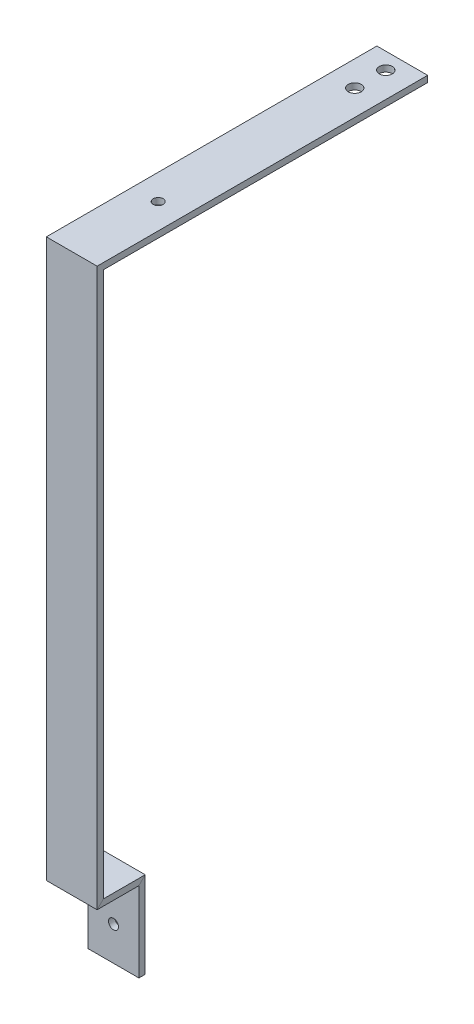
ISO-10303-21;
HEADER;
FILE_DESCRIPTION(('STEP AP214'),'2;1');
FILE_NAME('part.step','',(''),(''),'','','');
FILE_SCHEMA(('AUTOMOTIVE_DESIGN { 1 0 10303 214 1 1 1 1 }'));
ENDSEC;
DATA;
#1=APPLICATION_CONTEXT('core data for automotive mechanical design processes');
#2=APPLICATION_PROTOCOL_DEFINITION('international standard','automotive_design',2000,#1);
#3=PRODUCT_CONTEXT('',#1,'mechanical');
#4=PRODUCT('Part','Part','',(#3));
#5=PRODUCT_RELATED_PRODUCT_CATEGORY('part','',(#4));
#6=PRODUCT_DEFINITION_FORMATION('','',#4);
#7=PRODUCT_DEFINITION_CONTEXT('part definition',#1,'design');
#8=PRODUCT_DEFINITION('design','',#6,#7);
#9=PRODUCT_DEFINITION_SHAPE('','',#8);
#10=(LENGTH_UNIT() NAMED_UNIT(*) SI_UNIT(.MILLI.,.METRE.));
#11=(NAMED_UNIT(*) PLANE_ANGLE_UNIT() SI_UNIT($,.RADIAN.));
#12=(NAMED_UNIT(*) SI_UNIT($,.STERADIAN.) SOLID_ANGLE_UNIT());
#13=UNCERTAINTY_MEASURE_WITH_UNIT(LENGTH_MEASURE(1.E-05),#10,'distance_accuracy_value','');
#14=(GEOMETRIC_REPRESENTATION_CONTEXT(3) GLOBAL_UNCERTAINTY_ASSIGNED_CONTEXT((#13)) GLOBAL_UNIT_ASSIGNED_CONTEXT((#10,
#11,#12)) REPRESENTATION_CONTEXT('',''));
#15=CARTESIAN_POINT('',(0.,0.,0.));
#16=DIRECTION('',(0.,0.,1.));
#17=DIRECTION('',(1.,0.,0.));
#18=AXIS2_PLACEMENT_3D('',#15,#16,#17);
#19=CARTESIAN_POINT('',(-25.4,-3.155,330.7));
#20=DIRECTION('',(0.,1.,0.));
#21=DIRECTION('',(0.,0.,1.));
#22=AXIS2_PLACEMENT_3D('',#19,#20,#21);
#23=PLANE('',#22);
#24=CARTESIAN_POINT('',(0.,-3.155,244.19));
#25=DIRECTION('',(0.,1.,0.));
#26=DIRECTION('',(0.,0.,1.));
#27=AXIS2_PLACEMENT_3D('',#24,#25,#26);
#28=CIRCLE('',#27,5.);
#29=CARTESIAN_POINT('',(0.,-3.155,249.19));
#30=VERTEX_POINT('',#29);
#31=EDGE_CURVE('E434',#30,#30,#28,.T.);
#32=ORIENTED_EDGE('',*,*,#31,.T.);
#33=EDGE_LOOP('',(#32));
#34=FACE_BOUND('',#33,.T.);
#35=CARTESIAN_POINT('',(-8.98622050717394E-12,-3.155,16.4999999999967));
#36=DIRECTION('',(0.,1.,0.));
#37=DIRECTION('',(0.,0.,1.));
#38=AXIS2_PLACEMENT_3D('',#35,#36,#37);
#39=CIRCLE('',#38,6.50000000000047);
#40=CARTESIAN_POINT('',(-8.98622050717394E-12,-3.155,22.9999999999972));
#41=VERTEX_POINT('',#40);
#42=EDGE_CURVE('E284',#41,#41,#39,.T.);
#43=ORIENTED_EDGE('',*,*,#42,.T.);
#44=EDGE_LOOP('',(#43));
#45=FACE_BOUND('',#44,.T.);
#46=CARTESIAN_POINT('',(-8.87626373998164E-12,-3.155,47.4999999999967));
#47=DIRECTION('',(0.,1.,0.));
#48=DIRECTION('',(0.,0.,1.));
#49=AXIS2_PLACEMENT_3D('',#46,#47,#48);
#50=CIRCLE('',#49,6.50000000000047);
#51=CARTESIAN_POINT('',(-8.87626373998164E-12,-3.155,53.9999999999972));
#52=VERTEX_POINT('',#51);
#53=EDGE_CURVE('E283',#52,#52,#50,.T.);
#54=ORIENTED_EDGE('',*,*,#53,.T.);
#55=EDGE_LOOP('',(#54));
#56=FACE_BOUND('',#55,.T.);
#57=DIRECTION('',(1.,0.,0.));
#58=VECTOR('',#57,1.);
#59=CARTESIAN_POINT('',(25.4,-3.155,324.39));
#60=LINE('',#59,#58);
#61=CARTESIAN_POINT('',(-25.4,-3.155,324.39));
#62=VERTEX_POINT('',#61);
#63=CARTESIAN_POINT('',(25.4,-3.155,324.39));
#64=VERTEX_POINT('',#63);
#65=EDGE_CURVE('E51',#62,#64,#60,.T.);
#66=ORIENTED_EDGE('',*,*,#65,.F.);
#67=DIRECTION('',(0.,0.,-1.));
#68=VECTOR('',#67,1.);
#69=CARTESIAN_POINT('',(-25.4,-3.155,330.7));
#70=LINE('',#69,#68);
#71=CARTESIAN_POINT('',(-25.4,-3.155,0.));
#72=VERTEX_POINT('',#71);
#73=EDGE_CURVE('E86',#62,#72,#70,.T.);
#74=ORIENTED_EDGE('',*,*,#73,.T.);
#75=DIRECTION('',(1.,0.,0.));
#76=VECTOR('',#75,1.);
#77=CARTESIAN_POINT('',(-25.4,-3.155,0.));
#78=LINE('',#77,#76);
#79=CARTESIAN_POINT('',(25.4,-3.155,0.));
#80=VERTEX_POINT('',#79);
#81=EDGE_CURVE('E90',#72,#80,#78,.T.);
#82=ORIENTED_EDGE('',*,*,#81,.T.);
#83=DIRECTION('',(0.,0.,-1.));
#84=VECTOR('',#83,1.);
#85=CARTESIAN_POINT('',(25.4,-3.155,330.7));
#86=LINE('',#85,#84);
#87=EDGE_CURVE('E78',#64,#80,#86,.T.);
#88=ORIENTED_EDGE('',*,*,#87,.F.);
#89=EDGE_LOOP('',(#66,#74,#82,#88));
#90=FACE_BOUND('',#89,.T.);
#91=ADVANCED_FACE('F35',(#34,#45,#56,#90),#23,.F.);
#92=CARTESIAN_POINT('',(25.4,3.155,330.7));
#93=DIRECTION('',(-1.,0.,0.));
#94=DIRECTION('',(0.,0.,1.));
#95=AXIS2_PLACEMENT_3D('',#92,#93,#94);
#96=PLANE('',#95);
#97=DIRECTION('',(0.,1.,0.));
#98=VECTOR('',#97,1.);
#99=CARTESIAN_POINT('',(25.4,3.155,0.));
#100=LINE('',#99,#98);
#101=CARTESIAN_POINT('',(25.4,3.155,0.));
#102=VERTEX_POINT('',#101);
#103=EDGE_CURVE('E82',#80,#102,#100,.T.);
#104=ORIENTED_EDGE('',*,*,#103,.T.);
#105=DIRECTION('',(0.,0.,-1.));
#106=VECTOR('',#105,1.);
#107=CARTESIAN_POINT('',(25.4,3.155,330.7));
#108=LINE('',#107,#106);
#109=CARTESIAN_POINT('',(25.4,3.155,330.7));
#110=VERTEX_POINT('',#109);
#111=EDGE_CURVE('E11',#110,#102,#108,.T.);
#112=ORIENTED_EDGE('',*,*,#111,.F.);
#113=DIRECTION('',(0.,1.,0.));
#114=VECTOR('',#113,1.);
#115=CARTESIAN_POINT('',(25.4,3.155,330.7));
#116=LINE('',#115,#114);
#117=CARTESIAN_POINT('',(25.4,-554.51,330.7));
#118=VERTEX_POINT('',#117);
#119=EDGE_CURVE('E94',#118,#110,#116,.T.);
#120=ORIENTED_EDGE('',*,*,#119,.F.);
#121=DIRECTION('',(0.,0.707106781186548,-0.707106781186548));
#122=VECTOR('',#121,1.);
#123=CARTESIAN_POINT('',(25.4,-544.7775,320.9675));
#124=LINE('',#123,#122);
#125=CARTESIAN_POINT('',(25.4,-548.2,324.39));
#126=VERTEX_POINT('',#125);
#127=EDGE_CURVE('E120',#118,#126,#124,.T.);
#128=ORIENTED_EDGE('',*,*,#127,.T.);
#129=DIRECTION('',(0.,1.,0.));
#130=VECTOR('',#129,1.);
#131=CARTESIAN_POINT('',(25.4,-541.355,324.39));
#132=LINE('',#131,#130);
#133=EDGE_CURVE('E85',#126,#64,#132,.T.);
#134=ORIENTED_EDGE('',*,*,#133,.T.);
#135=ORIENTED_EDGE('',*,*,#87,.T.);
#136=EDGE_LOOP('',(#104,#112,#120,#128,#134,#135));
#137=FACE_BOUND('',#136,.T.);
#138=ADVANCED_FACE('F37',(#137),#96,.F.);
#139=CARTESIAN_POINT('',(-25.4,3.155,330.7));
#140=DIRECTION('',(0.,-1.,0.));
#141=DIRECTION('',(0.,0.,-1.));
#142=AXIS2_PLACEMENT_3D('',#139,#140,#141);
#143=PLANE('',#142);
#144=CARTESIAN_POINT('',(0.,3.155,244.19));
#145=DIRECTION('',(0.,1.,0.));
#146=DIRECTION('',(0.,0.,1.));
#147=AXIS2_PLACEMENT_3D('',#144,#145,#146);
#148=CIRCLE('',#147,5.);
#149=CARTESIAN_POINT('',(0.,3.155,249.19));
#150=VERTEX_POINT('',#149);
#151=EDGE_CURVE('E274',#150,#150,#148,.T.);
#152=ORIENTED_EDGE('',*,*,#151,.F.);
#153=EDGE_LOOP('',(#152));
#154=FACE_BOUND('',#153,.T.);
#155=CARTESIAN_POINT('',(-8.98622050717394E-12,3.155,16.4999999999967));
#156=DIRECTION('',(0.,1.,0.));
#157=DIRECTION('',(0.,0.,1.));
#158=AXIS2_PLACEMENT_3D('',#155,#156,#157);
#159=CIRCLE('',#158,6.50000000000047);
#160=CARTESIAN_POINT('',(-8.98622050717394E-12,3.155,22.9999999999972));
#161=VERTEX_POINT('',#160);
#162=EDGE_CURVE('E278',#161,#161,#159,.T.);
#163=ORIENTED_EDGE('',*,*,#162,.F.);
#164=EDGE_LOOP('',(#163));
#165=FACE_BOUND('',#164,.T.);
#166=CARTESIAN_POINT('',(-8.87626373998164E-12,3.155,47.4999999999967));
#167=DIRECTION('',(0.,1.,0.));
#168=DIRECTION('',(0.,0.,1.));
#169=AXIS2_PLACEMENT_3D('',#166,#167,#168);
#170=CIRCLE('',#169,6.50000000000047);
#171=CARTESIAN_POINT('',(-8.87626373998164E-12,3.155,53.9999999999972));
#172=VERTEX_POINT('',#171);
#173=EDGE_CURVE('E281',#172,#172,#170,.T.);
#174=ORIENTED_EDGE('',*,*,#173,.F.);
#175=EDGE_LOOP('',(#174));
#176=FACE_BOUND('',#175,.T.);
#177=DIRECTION('',(-1.,0.,0.));
#178=VECTOR('',#177,1.);
#179=CARTESIAN_POINT('',(-25.4,3.155,0.));
#180=LINE('',#179,#178);
#181=CARTESIAN_POINT('',(-25.4,3.155,0.));
#182=VERTEX_POINT('',#181);
#183=EDGE_CURVE('E98',#102,#182,#180,.T.);
#184=ORIENTED_EDGE('',*,*,#183,.T.);
#185=DIRECTION('',(0.,0.,-1.));
#186=VECTOR('',#185,1.);
#187=CARTESIAN_POINT('',(-25.4,3.155,330.7));
#188=LINE('',#187,#186);
#189=CARTESIAN_POINT('',(-25.4,3.155,330.7));
#190=VERTEX_POINT('',#189);
#191=EDGE_CURVE('E44',#190,#182,#188,.T.);
#192=ORIENTED_EDGE('',*,*,#191,.F.);
#193=DIRECTION('',(-1.,0.,0.));
#194=VECTOR('',#193,1.);
#195=CARTESIAN_POINT('',(-25.4,3.155,330.7));
#196=LINE('',#195,#194);
#197=EDGE_CURVE('E60',#110,#190,#196,.T.);
#198=ORIENTED_EDGE('',*,*,#197,.F.);
#199=ORIENTED_EDGE('',*,*,#111,.T.);
#200=EDGE_LOOP('',(#184,#192,#198,#199));
#201=FACE_BOUND('',#200,.T.);
#202=ADVANCED_FACE('F115',(#154,#165,#176,#201),#143,.F.);
#203=CARTESIAN_POINT('',(-25.4,3.155,330.7));
#204=DIRECTION('',(1.,0.,0.));
#205=DIRECTION('',(0.,0.,-1.));
#206=AXIS2_PLACEMENT_3D('',#203,#204,#205);
#207=PLANE('',#206);
#208=DIRECTION('',(0.,-1.,0.));
#209=VECTOR('',#208,1.);
#210=CARTESIAN_POINT('',(-25.4,3.155,0.));
#211=LINE('',#210,#209);
#212=EDGE_CURVE('E95',#182,#72,#211,.T.);
#213=ORIENTED_EDGE('',*,*,#212,.T.);
#214=ORIENTED_EDGE('',*,*,#73,.F.);
#215=DIRECTION('',(0.,1.,0.));
#216=VECTOR('',#215,1.);
#217=CARTESIAN_POINT('',(-25.4,-541.355,324.39));
#218=LINE('',#217,#216);
#219=CARTESIAN_POINT('',(-25.4,-548.2,324.39));
#220=VERTEX_POINT('',#219);
#221=EDGE_CURVE('E99',#220,#62,#218,.T.);
#222=ORIENTED_EDGE('',*,*,#221,.F.);
#223=DIRECTION('',(0.,-0.707106781186548,0.707106781186548));
#224=VECTOR('',#223,1.);
#225=CARTESIAN_POINT('',(-25.4,-547.9325,324.1225));
#226=LINE('',#225,#224);
#227=CARTESIAN_POINT('',(-25.4,-554.51,330.7));
#228=VERTEX_POINT('',#227);
#229=EDGE_CURVE('E148',#220,#228,#226,.T.);
#230=ORIENTED_EDGE('',*,*,#229,.T.);
#231=DIRECTION('',(0.,-1.,0.));
#232=VECTOR('',#231,1.);
#233=CARTESIAN_POINT('',(-25.4,3.155,330.7));
#234=LINE('',#233,#232);
#235=EDGE_CURVE('E87',#190,#228,#234,.T.);
#236=ORIENTED_EDGE('',*,*,#235,.F.);
#237=ORIENTED_EDGE('',*,*,#191,.T.);
#238=EDGE_LOOP('',(#213,#214,#222,#230,#236,#237));
#239=FACE_BOUND('',#238,.T.);
#240=ADVANCED_FACE('F112',(#239),#207,.F.);
#241=CARTESIAN_POINT('',(0.,0.,330.7));
#242=DIRECTION('',(0.,0.,1.));
#243=DIRECTION('',(1.,0.,0.));
#244=AXIS2_PLACEMENT_3D('',#241,#242,#243);
#245=PLANE('',#244);
#246=ORIENTED_EDGE('',*,*,#119,.T.);
#247=ORIENTED_EDGE('',*,*,#197,.T.);
#248=ORIENTED_EDGE('',*,*,#235,.T.);
#249=DIRECTION('',(1.,0.,0.));
#250=VECTOR('',#249,1.);
#251=CARTESIAN_POINT('',(25.4,-554.51,330.7));
#252=LINE('',#251,#250);
#253=EDGE_CURVE('E135',#228,#118,#252,.T.);
#254=ORIENTED_EDGE('',*,*,#253,.T.);
#255=EDGE_LOOP('',(#246,#247,#248,#254));
#256=FACE_BOUND('',#255,.T.);
#257=ADVANCED_FACE('F147',(#256),#245,.T.);
#258=CARTESIAN_POINT('',(0.,0.,0.));
#259=DIRECTION('',(0.,0.,1.));
#260=DIRECTION('',(1.,0.,0.));
#261=AXIS2_PLACEMENT_3D('',#258,#259,#260);
#262=PLANE('',#261);
#263=ORIENTED_EDGE('',*,*,#103,.F.);
#264=ORIENTED_EDGE('',*,*,#81,.F.);
#265=ORIENTED_EDGE('',*,*,#212,.F.);
#266=ORIENTED_EDGE('',*,*,#183,.F.);
#267=EDGE_LOOP('',(#263,#264,#265,#266));
#268=FACE_BOUND('',#267,.T.);
#269=ADVANCED_FACE('F97',(#268),#262,.F.);
#270=CARTESIAN_POINT('',(25.4,-541.355,324.39));
#271=DIRECTION('',(0.,0.,1.));
#272=DIRECTION('',(1.,0.,0.));
#273=AXIS2_PLACEMENT_3D('',#270,#271,#272);
#274=PLANE('',#273);
#275=ORIENTED_EDGE('',*,*,#65,.T.);
#276=ORIENTED_EDGE('',*,*,#133,.F.);
#277=DIRECTION('',(-1.,0.,0.));
#278=VECTOR('',#277,1.);
#279=CARTESIAN_POINT('',(-25.4,-548.2,324.39));
#280=LINE('',#279,#278);
#281=EDGE_CURVE('E150',#126,#220,#280,.T.);
#282=ORIENTED_EDGE('',*,*,#281,.T.);
#283=ORIENTED_EDGE('',*,*,#221,.T.);
#284=EDGE_LOOP('',(#275,#276,#282,#283));
#285=FACE_BOUND('',#284,.T.);
#286=ADVANCED_FACE('F196',(#285),#274,.F.);
#287=CARTESIAN_POINT('',(0.,-634.515,-41.8100000000001));
#288=DIRECTION('',(0.,-1.,0.));
#289=DIRECTION('',(0.,0.,-1.));
#290=AXIS2_PLACEMENT_3D('',#287,#288,#289);
#291=PLANE('',#290);
#292=DIRECTION('',(1.,0.,0.));
#293=VECTOR('',#292,1.);
#294=CARTESIAN_POINT('',(-25.4,-634.515,282.58));
#295=LINE('',#294,#293);
#296=CARTESIAN_POINT('',(-25.4,-634.515,282.58));
#297=VERTEX_POINT('',#296);
#298=CARTESIAN_POINT('',(25.4,-634.515,282.58));
#299=VERTEX_POINT('',#298);
#300=EDGE_CURVE('E180',#297,#299,#295,.T.);
#301=ORIENTED_EDGE('',*,*,#300,.T.);
#302=DIRECTION('',(0.,0.,1.));
#303=VECTOR('',#302,1.);
#304=CARTESIAN_POINT('',(25.4,-634.515,282.58));
#305=LINE('',#304,#303);
#306=CARTESIAN_POINT('',(25.4,-634.515,288.89));
#307=VERTEX_POINT('',#306);
#308=EDGE_CURVE('E177',#299,#307,#305,.T.);
#309=ORIENTED_EDGE('',*,*,#308,.T.);
#310=DIRECTION('',(-1.,0.,0.));
#311=VECTOR('',#310,1.);
#312=CARTESIAN_POINT('',(25.4,-634.515,288.89));
#313=LINE('',#312,#311);
#314=CARTESIAN_POINT('',(-25.4,-634.515,288.89));
#315=VERTEX_POINT('',#314);
#316=EDGE_CURVE('E174',#307,#315,#313,.T.);
#317=ORIENTED_EDGE('',*,*,#316,.T.);
#318=DIRECTION('',(0.,0.,-1.));
#319=VECTOR('',#318,1.);
#320=CARTESIAN_POINT('',(-25.4,-634.515,288.89));
#321=LINE('',#320,#319);
#322=EDGE_CURVE('E171',#315,#297,#321,.T.);
#323=ORIENTED_EDGE('',*,*,#322,.T.);
#324=EDGE_LOOP('',(#301,#309,#317,#323));
#325=FACE_BOUND('',#324,.T.);
#326=ADVANCED_FACE('F238',(#325),#291,.T.);
#327=CARTESIAN_POINT('',(-25.4,-547.7845,282.58));
#328=DIRECTION('',(0.,0.,-1.));
#329=DIRECTION('',(-1.,0.,0.));
#330=AXIS2_PLACEMENT_3D('',#327,#328,#329);
#331=PLANE('',#330);
#332=CARTESIAN_POINT('',(0.,-600.505,282.58));
#333=DIRECTION('',(0.,0.,-1.));
#334=DIRECTION('',(-1.,0.,0.));
#335=AXIS2_PLACEMENT_3D('',#332,#333,#334);
#336=CIRCLE('',#335,5.00000000000001);
#337=CARTESIAN_POINT('',(-5.,-600.505,282.58));
#338=VERTEX_POINT('',#337);
#339=EDGE_CURVE('E287',#338,#338,#336,.T.);
#340=ORIENTED_EDGE('',*,*,#339,.F.);
#341=EDGE_LOOP('',(#340));
#342=FACE_BOUND('',#341,.T.);
#343=DIRECTION('',(-1.,0.,0.));
#344=VECTOR('',#343,1.);
#345=CARTESIAN_POINT('',(-25.4,-548.2,282.58));
#346=LINE('',#345,#344);
#347=CARTESIAN_POINT('',(25.4,-548.2,282.58));
#348=VERTEX_POINT('',#347);
#349=CARTESIAN_POINT('',(-25.4,-548.2,282.58));
#350=VERTEX_POINT('',#349);
#351=EDGE_CURVE('E162',#348,#350,#346,.T.);
#352=ORIENTED_EDGE('',*,*,#351,.F.);
#353=DIRECTION('',(0.,-1.,0.));
#354=VECTOR('',#353,1.);
#355=CARTESIAN_POINT('',(25.4,-547.7845,282.58));
#356=LINE('',#355,#354);
#357=EDGE_CURVE('E189',#348,#299,#356,.T.);
#358=ORIENTED_EDGE('',*,*,#357,.T.);
#359=ORIENTED_EDGE('',*,*,#300,.F.);
#360=DIRECTION('',(0.,-1.,0.));
#361=VECTOR('',#360,1.);
#362=CARTESIAN_POINT('',(-25.4,-547.7845,282.58));
#363=LINE('',#362,#361);
#364=EDGE_CURVE('E163',#350,#297,#363,.T.);
#365=ORIENTED_EDGE('',*,*,#364,.F.);
#366=EDGE_LOOP('',(#352,#358,#359,#365));
#367=FACE_BOUND('',#366,.T.);
#368=ADVANCED_FACE('F230',(#342,#367),#331,.T.);
#369=CARTESIAN_POINT('',(25.4,-547.7845,282.58));
#370=DIRECTION('',(1.,0.,0.));
#371=DIRECTION('',(0.,0.,-1.));
#372=AXIS2_PLACEMENT_3D('',#369,#370,#371);
#373=PLANE('',#372);
#374=DIRECTION('',(0.,0.707106781186548,-0.707106781186548));
#375=VECTOR('',#374,1.);
#376=CARTESIAN_POINT('',(25.4,-572.46775,306.84775));
#377=LINE('',#376,#375);
#378=CARTESIAN_POINT('',(25.4,-554.51,288.89));
#379=VERTEX_POINT('',#378);
#380=EDGE_CURVE('E156',#379,#348,#377,.T.);
#381=ORIENTED_EDGE('',*,*,#380,.F.);
#382=DIRECTION('',(0.,-1.,0.));
#383=VECTOR('',#382,1.);
#384=CARTESIAN_POINT('',(25.4,-547.7845,288.89));
#385=LINE('',#384,#383);
#386=EDGE_CURVE('E186',#379,#307,#385,.T.);
#387=ORIENTED_EDGE('',*,*,#386,.T.);
#388=ORIENTED_EDGE('',*,*,#308,.F.);
#389=ORIENTED_EDGE('',*,*,#357,.F.);
#390=EDGE_LOOP('',(#381,#387,#388,#389));
#391=FACE_BOUND('',#390,.T.);
#392=ADVANCED_FACE('F234',(#391),#373,.T.);
#393=CARTESIAN_POINT('',(25.4,-547.7845,288.89));
#394=DIRECTION('',(0.,0.,1.));
#395=DIRECTION('',(1.,0.,0.));
#396=AXIS2_PLACEMENT_3D('',#393,#394,#395);
#397=PLANE('',#396);
#398=CARTESIAN_POINT('',(0.,-600.505,288.89));
#399=DIRECTION('',(0.,0.,1.));
#400=DIRECTION('',(1.,0.,0.));
#401=AXIS2_PLACEMENT_3D('',#398,#399,#400);
#402=CIRCLE('',#401,5.00000000000001);
#403=CARTESIAN_POINT('',(5.00000000000002,-600.505,288.89));
#404=VERTEX_POINT('',#403);
#405=EDGE_CURVE('E39',#404,#404,#402,.T.);
#406=ORIENTED_EDGE('',*,*,#405,.F.);
#407=EDGE_LOOP('',(#406));
#408=FACE_BOUND('',#407,.T.);
#409=DIRECTION('',(1.,0.,0.));
#410=VECTOR('',#409,1.);
#411=CARTESIAN_POINT('',(25.4,-554.51,288.89));
#412=LINE('',#411,#410);
#413=CARTESIAN_POINT('',(-25.4,-554.51,288.89));
#414=VERTEX_POINT('',#413);
#415=EDGE_CURVE('E144',#414,#379,#412,.T.);
#416=ORIENTED_EDGE('',*,*,#415,.F.);
#417=DIRECTION('',(0.,-1.,0.));
#418=VECTOR('',#417,1.);
#419=CARTESIAN_POINT('',(-25.4,-547.7845,288.89));
#420=LINE('',#419,#418);
#421=EDGE_CURVE('E183',#414,#315,#420,.T.);
#422=ORIENTED_EDGE('',*,*,#421,.T.);
#423=ORIENTED_EDGE('',*,*,#316,.F.);
#424=ORIENTED_EDGE('',*,*,#386,.F.);
#425=EDGE_LOOP('',(#416,#422,#423,#424));
#426=FACE_BOUND('',#425,.T.);
#427=ADVANCED_FACE('F241',(#408,#426),#397,.T.);
#428=CARTESIAN_POINT('',(-25.4,-547.7845,288.89));
#429=DIRECTION('',(-1.,0.,0.));
#430=DIRECTION('',(0.,0.,1.));
#431=AXIS2_PLACEMENT_3D('',#428,#429,#430);
#432=PLANE('',#431);
#433=DIRECTION('',(0.,-0.707106781186548,0.707106781186548));
#434=VECTOR('',#433,1.);
#435=CARTESIAN_POINT('',(-25.4,-575.62275,310.00275));
#436=LINE('',#435,#434);
#437=EDGE_CURVE('E159',#350,#414,#436,.T.);
#438=ORIENTED_EDGE('',*,*,#437,.F.);
#439=ORIENTED_EDGE('',*,*,#364,.T.);
#440=ORIENTED_EDGE('',*,*,#322,.F.);
#441=ORIENTED_EDGE('',*,*,#421,.F.);
#442=EDGE_LOOP('',(#438,#439,#440,#441));
#443=FACE_BOUND('',#442,.T.);
#444=ADVANCED_FACE('F244',(#443),#432,.T.);
#445=CARTESIAN_POINT('',(-25.4,-554.51,331.1155));
#446=DIRECTION('',(-1.,0.,0.));
#447=DIRECTION('',(0.,0.,1.));
#448=AXIS2_PLACEMENT_3D('',#445,#446,#447);
#449=PLANE('',#448);
#450=DIRECTION('',(0.,0.,-1.));
#451=VECTOR('',#450,1.);
#452=CARTESIAN_POINT('',(-25.4,-548.2,331.1155));
#453=LINE('',#452,#451);
#454=EDGE_CURVE('E166',#220,#350,#453,.T.);
#455=ORIENTED_EDGE('',*,*,#454,.T.);
#456=ORIENTED_EDGE('',*,*,#437,.T.);
#457=DIRECTION('',(0.,0.,-1.));
#458=VECTOR('',#457,1.);
#459=CARTESIAN_POINT('',(-25.4,-554.51,331.1155));
#460=LINE('',#459,#458);
#461=EDGE_CURVE('E145',#228,#414,#460,.T.);
#462=ORIENTED_EDGE('',*,*,#461,.F.);
#463=ORIENTED_EDGE('',*,*,#229,.F.);
#464=EDGE_LOOP('',(#455,#456,#462,#463));
#465=FACE_BOUND('',#464,.T.);
#466=ADVANCED_FACE('F224',(#465),#449,.T.);
#467=CARTESIAN_POINT('',(25.4,-554.51,331.1155));
#468=DIRECTION('',(0.,-1.,0.));
#469=DIRECTION('',(0.,0.,-1.));
#470=AXIS2_PLACEMENT_3D('',#467,#468,#469);
#471=PLANE('',#470);
#472=ORIENTED_EDGE('',*,*,#461,.T.);
#473=ORIENTED_EDGE('',*,*,#415,.T.);
#474=DIRECTION('',(0.,0.,-1.));
#475=VECTOR('',#474,1.);
#476=CARTESIAN_POINT('',(25.4,-554.51,331.1155));
#477=LINE('',#476,#475);
#478=EDGE_CURVE('E132',#118,#379,#477,.T.);
#479=ORIENTED_EDGE('',*,*,#478,.F.);
#480=ORIENTED_EDGE('',*,*,#253,.F.);
#481=EDGE_LOOP('',(#472,#473,#479,#480));
#482=FACE_BOUND('',#481,.T.);
#483=ADVANCED_FACE('F141',(#482),#471,.T.);
#484=CARTESIAN_POINT('',(25.4,-548.2,331.1155));
#485=DIRECTION('',(1.,0.,0.));
#486=DIRECTION('',(0.,0.,-1.));
#487=AXIS2_PLACEMENT_3D('',#484,#485,#486);
#488=PLANE('',#487);
#489=ORIENTED_EDGE('',*,*,#478,.T.);
#490=ORIENTED_EDGE('',*,*,#380,.T.);
#491=DIRECTION('',(0.,0.,-1.));
#492=VECTOR('',#491,1.);
#493=CARTESIAN_POINT('',(25.4,-548.2,331.1155));
#494=LINE('',#493,#492);
#495=EDGE_CURVE('E134',#126,#348,#494,.T.);
#496=ORIENTED_EDGE('',*,*,#495,.F.);
#497=ORIENTED_EDGE('',*,*,#127,.F.);
#498=EDGE_LOOP('',(#489,#490,#496,#497));
#499=FACE_BOUND('',#498,.T.);
#500=ADVANCED_FACE('F129',(#499),#488,.T.);
#501=CARTESIAN_POINT('',(-25.4,-548.2,331.1155));
#502=DIRECTION('',(0.,1.,0.));
#503=DIRECTION('',(0.,0.,1.));
#504=AXIS2_PLACEMENT_3D('',#501,#502,#503);
#505=PLANE('',#504);
#506=ORIENTED_EDGE('',*,*,#495,.T.);
#507=ORIENTED_EDGE('',*,*,#351,.T.);
#508=ORIENTED_EDGE('',*,*,#454,.F.);
#509=ORIENTED_EDGE('',*,*,#281,.F.);
#510=EDGE_LOOP('',(#506,#507,#508,#509));
#511=FACE_BOUND('',#510,.T.);
#512=ADVANCED_FACE('F226',(#511),#505,.T.);
#513=CARTESIAN_POINT('',(0.,-600.505,298.455));
#514=DIRECTION('',(0.,0.,-1.));
#515=DIRECTION('',(-1.,0.,0.));
#516=AXIS2_PLACEMENT_3D('',#513,#514,#515);
#517=CYLINDRICAL_SURFACE('',#516,5.00000000000001);
#518=ORIENTED_EDGE('',*,*,#405,.T.);
#519=EDGE_LOOP('',(#518));
#520=FACE_BOUND('',#519,.T.);
#521=ORIENTED_EDGE('',*,*,#339,.T.);
#522=EDGE_LOOP('',(#521));
#523=FACE_BOUND('',#522,.T.);
#524=ADVANCED_FACE('F298',(#520,#523),#517,.F.);
#525=CARTESIAN_POINT('',(-8.87626373998164E-12,-12.72,47.4999999999967));
#526=DIRECTION('',(0.,1.,0.));
#527=DIRECTION('',(0.,0.,1.));
#528=AXIS2_PLACEMENT_3D('',#525,#526,#527);
#529=CYLINDRICAL_SURFACE('',#528,6.50000000000047);
#530=ORIENTED_EDGE('',*,*,#173,.T.);
#531=EDGE_LOOP('',(#530));
#532=FACE_BOUND('',#531,.T.);
#533=ORIENTED_EDGE('',*,*,#53,.F.);
#534=EDGE_LOOP('',(#533));
#535=FACE_BOUND('',#534,.T.);
#536=ADVANCED_FACE('F300',(#532,#535),#529,.F.);
#537=CARTESIAN_POINT('',(-8.98622050717394E-12,-12.72,16.4999999999967));
#538=DIRECTION('',(0.,1.,0.));
#539=DIRECTION('',(0.,0.,1.));
#540=AXIS2_PLACEMENT_3D('',#537,#538,#539);
#541=CYLINDRICAL_SURFACE('',#540,6.50000000000047);
#542=ORIENTED_EDGE('',*,*,#162,.T.);
#543=EDGE_LOOP('',(#542));
#544=FACE_BOUND('',#543,.T.);
#545=ORIENTED_EDGE('',*,*,#42,.F.);
#546=EDGE_LOOP('',(#545));
#547=FACE_BOUND('',#546,.T.);
#548=ADVANCED_FACE('F306',(#544,#547),#541,.F.);
#549=CARTESIAN_POINT('',(0.,-6.845,244.19));
#550=DIRECTION('',(0.,1.,0.));
#551=DIRECTION('',(0.,0.,1.));
#552=AXIS2_PLACEMENT_3D('',#549,#550,#551);
#553=CYLINDRICAL_SURFACE('',#552,5.);
#554=ORIENTED_EDGE('',*,*,#151,.T.);
#555=EDGE_LOOP('',(#554));
#556=FACE_BOUND('',#555,.T.);
#557=ORIENTED_EDGE('',*,*,#31,.F.);
#558=EDGE_LOOP('',(#557));
#559=FACE_BOUND('',#558,.T.);
#560=ADVANCED_FACE('F406',(#556,#559),#553,.F.);
#561=CLOSED_SHELL('',(#91,#138,#202,#240,#257,#269,#286,#326,#368,#392,#427,#444,#466,#483,#500,
#512,#524,#536,#548,#560));
#562=MANIFOLD_SOLID_BREP('B2',#561);
#563=ADVANCED_BREP_SHAPE_REPRESENTATION('',(#18,#562),#14);
#564=SHAPE_DEFINITION_REPRESENTATION(#9,#563);
ENDSEC;
END-ISO-10303-21;
